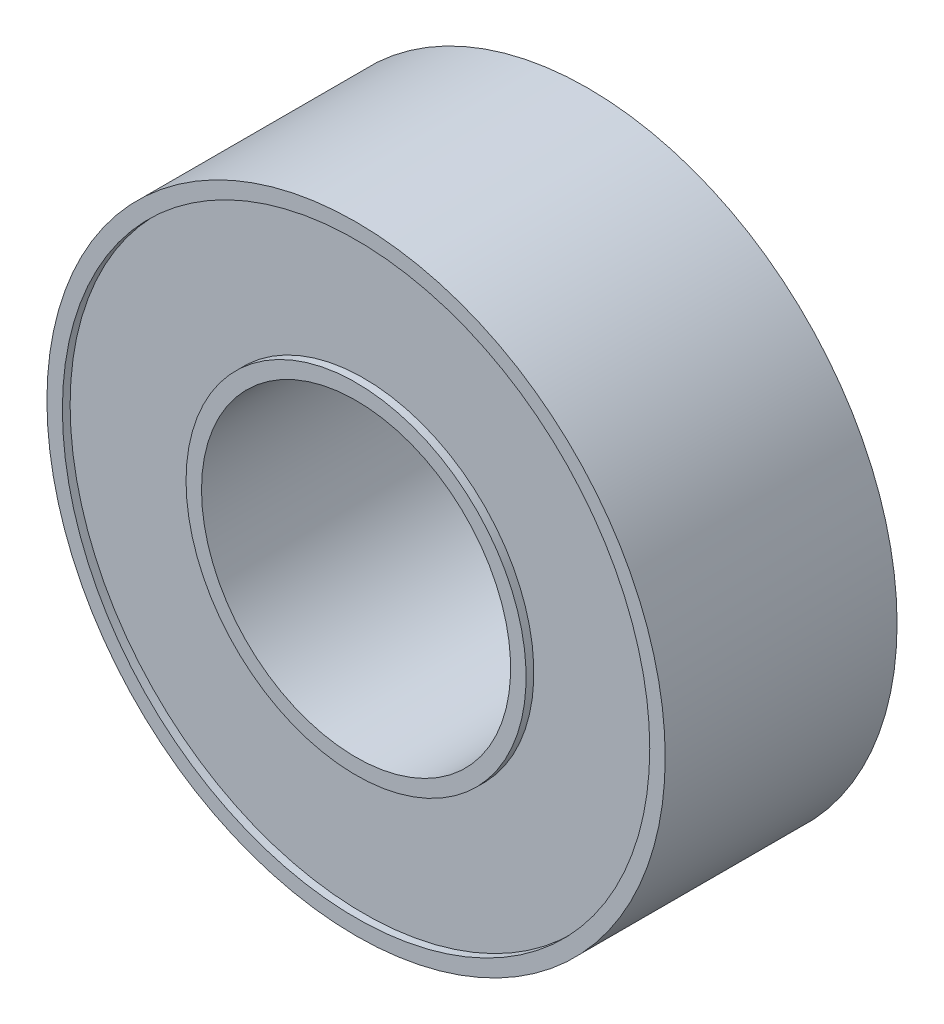
ISO-10303-21;
HEADER;
FILE_DESCRIPTION(('STEP AP214'),'2;1');
FILE_NAME('part.step','',(''),(''),'','','');
FILE_SCHEMA(('AUTOMOTIVE_DESIGN { 1 0 10303 214 1 1 1 1 }'));
ENDSEC;
DATA;
#1=APPLICATION_CONTEXT('core data for automotive mechanical design processes');
#2=APPLICATION_PROTOCOL_DEFINITION('international standard','automotive_design',2000,#1);
#3=PRODUCT_CONTEXT('',#1,'mechanical');
#4=PRODUCT('Part','Part','',(#3));
#5=PRODUCT_RELATED_PRODUCT_CATEGORY('part','',(#4));
#6=PRODUCT_DEFINITION_FORMATION('','',#4);
#7=PRODUCT_DEFINITION_CONTEXT('part definition',#1,'design');
#8=PRODUCT_DEFINITION('design','',#6,#7);
#9=PRODUCT_DEFINITION_SHAPE('','',#8);
#10=(LENGTH_UNIT() NAMED_UNIT(*) SI_UNIT(.MILLI.,.METRE.));
#11=(NAMED_UNIT(*) PLANE_ANGLE_UNIT() SI_UNIT($,.RADIAN.));
#12=(NAMED_UNIT(*) SI_UNIT($,.STERADIAN.) SOLID_ANGLE_UNIT());
#13=UNCERTAINTY_MEASURE_WITH_UNIT(LENGTH_MEASURE(1.E-05),#10,'distance_accuracy_value','');
#14=(GEOMETRIC_REPRESENTATION_CONTEXT(3) GLOBAL_UNCERTAINTY_ASSIGNED_CONTEXT((#13)) GLOBAL_UNIT_ASSIGNED_CONTEXT((#10,
#11,#12)) REPRESENTATION_CONTEXT('',''));
#15=CARTESIAN_POINT('',(0.,0.,0.));
#16=DIRECTION('',(0.,0.,1.));
#17=DIRECTION('',(1.,0.,0.));
#18=AXIS2_PLACEMENT_3D('',#15,#16,#17);
#19=CARTESIAN_POINT('',(0.,0.,-1.5));
#20=DIRECTION('',(0.,0.,1.));
#21=DIRECTION('',(1.,0.,0.));
#22=AXIS2_PLACEMENT_3D('',#19,#20,#21);
#23=PLANE('',#22);
#24=CARTESIAN_POINT('',(0.,0.,-1.5));
#25=DIRECTION('',(0.,0.,-1.));
#26=DIRECTION('',(1.,0.,0.));
#27=AXIS2_PLACEMENT_3D('',#24,#25,#26);
#28=CIRCLE('',#27,3.8);
#29=CARTESIAN_POINT('',(-3.8,0.,-1.5));
#30=VERTEX_POINT('',#29);
#31=EDGE_CURVE('P0_E61',#30,#30,#28,.T.);
#32=ORIENTED_EDGE('',*,*,#31,.F.);
#33=EDGE_LOOP('',(#32));
#34=FACE_BOUND('',#33,.T.);
#35=CARTESIAN_POINT('',(0.,0.,-1.5));
#36=DIRECTION('',(0.,0.,1.));
#37=DIRECTION('',(1.,0.,0.));
#38=AXIS2_PLACEMENT_3D('',#35,#36,#37);
#39=CIRCLE('',#38,4.);
#40=CARTESIAN_POINT('',(-4.,0.,-1.5));
#41=VERTEX_POINT('',#40);
#42=EDGE_CURVE('P0_E26',#41,#41,#39,.T.);
#43=ORIENTED_EDGE('',*,*,#42,.F.);
#44=EDGE_LOOP('',(#43));
#45=FACE_BOUND('',#44,.T.);
#46=ADVANCED_FACE('P0_F17',(#34,#45),#23,.F.);
#47=CARTESIAN_POINT('',(0.,0.,0.));
#48=DIRECTION('',(0.,0.,1.));
#49=DIRECTION('',(1.,0.,0.));
#50=AXIS2_PLACEMENT_3D('',#47,#48,#49);
#51=CYLINDRICAL_SURFACE('',#50,4.);
#52=ORIENTED_EDGE('',*,*,#42,.T.);
#53=DIRECTION('',(0.,0.,1.));
#54=VECTOR('',#53,1.);
#55=CARTESIAN_POINT('',(-4.,0.,0.));
#56=LINE('',#55,#54);
#57=CARTESIAN_POINT('',(-4.,0.,1.5));
#58=VERTEX_POINT('',#57);
#59=EDGE_CURVE('P0_E11',#41,#58,#56,.T.);
#60=ORIENTED_EDGE('',*,*,#59,.T.);
#61=CARTESIAN_POINT('',(0.,0.,1.5));
#62=DIRECTION('',(0.,0.,-1.));
#63=DIRECTION('',(1.,0.,0.));
#64=AXIS2_PLACEMENT_3D('',#61,#62,#63);
#65=CIRCLE('',#64,4.);
#66=EDGE_CURVE('P0_E52',#58,#58,#65,.T.);
#67=ORIENTED_EDGE('',*,*,#66,.T.);
#68=ORIENTED_EDGE('',*,*,#59,.F.);
#69=EDGE_LOOP('',(#52,#60,#67,#68));
#70=FACE_BOUND('',#69,.T.);
#71=ADVANCED_FACE('P0_F50',(#70),#51,.T.);
#72=CARTESIAN_POINT('',(0.,0.,0.));
#73=DIRECTION('',(0.,0.,1.));
#74=DIRECTION('',(1.,0.,0.));
#75=AXIS2_PLACEMENT_3D('',#72,#73,#74);
#76=CYLINDRICAL_SURFACE('',#75,3.8);
#77=ORIENTED_EDGE('',*,*,#31,.T.);
#78=DIRECTION('',(0.,0.,1.));
#79=VECTOR('',#78,1.);
#80=CARTESIAN_POINT('',(-3.8,0.,0.));
#81=LINE('',#80,#79);
#82=CARTESIAN_POINT('',(-3.8,0.,1.5));
#83=VERTEX_POINT('',#82);
#84=EDGE_CURVE('P0_E47',#30,#83,#81,.T.);
#85=ORIENTED_EDGE('',*,*,#84,.T.);
#86=CARTESIAN_POINT('',(0.,0.,1.5));
#87=DIRECTION('',(0.,0.,1.));
#88=DIRECTION('',(1.,0.,0.));
#89=AXIS2_PLACEMENT_3D('',#86,#87,#88);
#90=CIRCLE('',#89,3.8);
#91=EDGE_CURVE('P0_E64',#83,#83,#90,.T.);
#92=ORIENTED_EDGE('',*,*,#91,.T.);
#93=ORIENTED_EDGE('',*,*,#84,.F.);
#94=EDGE_LOOP('',(#77,#85,#92,#93));
#95=FACE_BOUND('',#94,.T.);
#96=ADVANCED_FACE('P0_F96',(#95),#76,.F.);
#97=CARTESIAN_POINT('',(0.,0.,1.5));
#98=DIRECTION('',(0.,0.,1.));
#99=DIRECTION('',(1.,0.,0.));
#100=AXIS2_PLACEMENT_3D('',#97,#98,#99);
#101=PLANE('',#100);
#102=ORIENTED_EDGE('',*,*,#91,.F.);
#103=EDGE_LOOP('',(#102));
#104=FACE_BOUND('',#103,.T.);
#105=ORIENTED_EDGE('',*,*,#66,.F.);
#106=EDGE_LOOP('',(#105));
#107=FACE_BOUND('',#106,.T.);
#108=ADVANCED_FACE('P0_F92',(#104,#107),#101,.T.);
#109=CLOSED_SHELL('',(#46,#71,#96,#108));
#110=MANIFOLD_SOLID_BREP('P0_B1',#109);
#111=CARTESIAN_POINT('',(0.,0.,-1.5));
#112=DIRECTION('',(0.,0.,1.));
#113=DIRECTION('',(1.,0.,0.));
#114=AXIS2_PLACEMENT_3D('',#111,#112,#113);
#115=PLANE('',#114);
#116=CARTESIAN_POINT('',(0.,0.,-1.5));
#117=DIRECTION('',(0.,0.,-1.));
#118=DIRECTION('',(1.,0.,0.));
#119=AXIS2_PLACEMENT_3D('',#116,#117,#118);
#120=CIRCLE('',#119,2.);
#121=CARTESIAN_POINT('',(-2.,0.,-1.5));
#122=VERTEX_POINT('',#121);
#123=EDGE_CURVE('P1_E61',#122,#122,#120,.T.);
#124=ORIENTED_EDGE('',*,*,#123,.F.);
#125=EDGE_LOOP('',(#124));
#126=FACE_BOUND('',#125,.T.);
#127=CARTESIAN_POINT('',(0.,0.,-1.5));
#128=DIRECTION('',(0.,0.,1.));
#129=DIRECTION('',(1.,0.,0.));
#130=AXIS2_PLACEMENT_3D('',#127,#128,#129);
#131=CIRCLE('',#130,2.2);
#132=CARTESIAN_POINT('',(-2.2,0.,-1.5));
#133=VERTEX_POINT('',#132);
#134=EDGE_CURVE('P1_E25',#133,#133,#131,.T.);
#135=ORIENTED_EDGE('',*,*,#134,.F.);
#136=EDGE_LOOP('',(#135));
#137=FACE_BOUND('',#136,.T.);
#138=ADVANCED_FACE('P1_F17',(#126,#137),#115,.F.);
#139=CARTESIAN_POINT('',(0.,0.,0.));
#140=DIRECTION('',(0.,0.,1.));
#141=DIRECTION('',(1.,0.,0.));
#142=AXIS2_PLACEMENT_3D('',#139,#140,#141);
#143=CYLINDRICAL_SURFACE('',#142,2.2);
#144=ORIENTED_EDGE('',*,*,#134,.T.);
#145=DIRECTION('',(0.,0.,1.));
#146=VECTOR('',#145,1.);
#147=CARTESIAN_POINT('',(-2.2,0.,0.));
#148=LINE('',#147,#146);
#149=CARTESIAN_POINT('',(-2.2,0.,1.5));
#150=VERTEX_POINT('',#149);
#151=EDGE_CURVE('P1_E11',#133,#150,#148,.T.);
#152=ORIENTED_EDGE('',*,*,#151,.T.);
#153=CARTESIAN_POINT('',(0.,0.,1.5));
#154=DIRECTION('',(0.,0.,-1.));
#155=DIRECTION('',(1.,0.,0.));
#156=AXIS2_PLACEMENT_3D('',#153,#154,#155);
#157=CIRCLE('',#156,2.2);
#158=EDGE_CURVE('P1_E53',#150,#150,#157,.T.);
#159=ORIENTED_EDGE('',*,*,#158,.T.);
#160=ORIENTED_EDGE('',*,*,#151,.F.);
#161=EDGE_LOOP('',(#144,#152,#159,#160));
#162=FACE_BOUND('',#161,.T.);
#163=ADVANCED_FACE('P1_F51',(#162),#143,.T.);
#164=CARTESIAN_POINT('',(0.,0.,0.));
#165=DIRECTION('',(0.,0.,1.));
#166=DIRECTION('',(1.,0.,0.));
#167=AXIS2_PLACEMENT_3D('',#164,#165,#166);
#168=CYLINDRICAL_SURFACE('',#167,2.);
#169=ORIENTED_EDGE('',*,*,#123,.T.);
#170=DIRECTION('',(0.,0.,1.));
#171=VECTOR('',#170,1.);
#172=CARTESIAN_POINT('',(-2.,0.,0.));
#173=LINE('',#172,#171);
#174=CARTESIAN_POINT('',(-2.,0.,1.5));
#175=VERTEX_POINT('',#174);
#176=EDGE_CURVE('P1_E44',#122,#175,#173,.T.);
#177=ORIENTED_EDGE('',*,*,#176,.T.);
#178=CARTESIAN_POINT('',(0.,0.,1.5));
#179=DIRECTION('',(0.,0.,1.));
#180=DIRECTION('',(1.,0.,0.));
#181=AXIS2_PLACEMENT_3D('',#178,#179,#180);
#182=CIRCLE('',#181,2.);
#183=EDGE_CURVE('P1_E66',#175,#175,#182,.T.);
#184=ORIENTED_EDGE('',*,*,#183,.T.);
#185=ORIENTED_EDGE('',*,*,#176,.F.);
#186=EDGE_LOOP('',(#169,#177,#184,#185));
#187=FACE_BOUND('',#186,.T.);
#188=ADVANCED_FACE('P1_F95',(#187),#168,.F.);
#189=CARTESIAN_POINT('',(0.,0.,1.5));
#190=DIRECTION('',(0.,0.,1.));
#191=DIRECTION('',(1.,0.,0.));
#192=AXIS2_PLACEMENT_3D('',#189,#190,#191);
#193=PLANE('',#192);
#194=ORIENTED_EDGE('',*,*,#183,.F.);
#195=EDGE_LOOP('',(#194));
#196=FACE_BOUND('',#195,.T.);
#197=ORIENTED_EDGE('',*,*,#158,.F.);
#198=EDGE_LOOP('',(#197));
#199=FACE_BOUND('',#198,.T.);
#200=ADVANCED_FACE('P1_F91',(#196,#199),#193,.T.);
#201=CLOSED_SHELL('',(#138,#163,#188,#200));
#202=MANIFOLD_SOLID_BREP('P1_B1',#201);
#203=CARTESIAN_POINT('',(0.,0.,-1.4));
#204=DIRECTION('',(0.,0.,1.));
#205=DIRECTION('',(1.,0.,0.));
#206=AXIS2_PLACEMENT_3D('',#203,#204,#205);
#207=PLANE('',#206);
#208=CARTESIAN_POINT('',(0.,0.,-1.4));
#209=DIRECTION('',(0.,0.,-1.));
#210=DIRECTION('',(1.,0.,0.));
#211=AXIS2_PLACEMENT_3D('',#208,#209,#210);
#212=CIRCLE('',#211,2.2);
#213=CARTESIAN_POINT('',(-2.2,0.,-1.4));
#214=VERTEX_POINT('',#213);
#215=EDGE_CURVE('P2_E61',#214,#214,#212,.T.);
#216=ORIENTED_EDGE('',*,*,#215,.F.);
#217=EDGE_LOOP('',(#216));
#218=FACE_BOUND('',#217,.T.);
#219=CARTESIAN_POINT('',(0.,0.,-1.4));
#220=DIRECTION('',(0.,0.,1.));
#221=DIRECTION('',(1.,0.,0.));
#222=AXIS2_PLACEMENT_3D('',#219,#220,#221);
#223=CIRCLE('',#222,3.8);
#224=CARTESIAN_POINT('',(-3.8,0.,-1.4));
#225=VERTEX_POINT('',#224);
#226=EDGE_CURVE('P2_E20',#225,#225,#223,.T.);
#227=ORIENTED_EDGE('',*,*,#226,.F.);
#228=EDGE_LOOP('',(#227));
#229=FACE_BOUND('',#228,.T.);
#230=ADVANCED_FACE('P2_F17',(#218,#229),#207,.F.);
#231=CARTESIAN_POINT('',(0.,0.,0.));
#232=DIRECTION('',(0.,0.,1.));
#233=DIRECTION('',(1.,0.,0.));
#234=AXIS2_PLACEMENT_3D('',#231,#232,#233);
#235=CYLINDRICAL_SURFACE('',#234,3.8);
#236=ORIENTED_EDGE('',*,*,#226,.T.);
#237=DIRECTION('',(0.,0.,1.));
#238=VECTOR('',#237,1.);
#239=CARTESIAN_POINT('',(-3.8,0.,0.));
#240=LINE('',#239,#238);
#241=CARTESIAN_POINT('',(-3.8,0.,1.4));
#242=VERTEX_POINT('',#241);
#243=EDGE_CURVE('P2_E11',#225,#242,#240,.T.);
#244=ORIENTED_EDGE('',*,*,#243,.T.);
#245=CARTESIAN_POINT('',(0.,0.,1.4));
#246=DIRECTION('',(0.,0.,-1.));
#247=DIRECTION('',(1.,0.,0.));
#248=AXIS2_PLACEMENT_3D('',#245,#246,#247);
#249=CIRCLE('',#248,3.8);
#250=EDGE_CURVE('P2_E53',#242,#242,#249,.T.);
#251=ORIENTED_EDGE('',*,*,#250,.T.);
#252=ORIENTED_EDGE('',*,*,#243,.F.);
#253=EDGE_LOOP('',(#236,#244,#251,#252));
#254=FACE_BOUND('',#253,.T.);
#255=ADVANCED_FACE('P2_F51',(#254),#235,.T.);
#256=CARTESIAN_POINT('',(0.,0.,0.));
#257=DIRECTION('',(0.,0.,1.));
#258=DIRECTION('',(1.,0.,0.));
#259=AXIS2_PLACEMENT_3D('',#256,#257,#258);
#260=CYLINDRICAL_SURFACE('',#259,2.2);
#261=ORIENTED_EDGE('',*,*,#215,.T.);
#262=DIRECTION('',(0.,0.,1.));
#263=VECTOR('',#262,1.);
#264=CARTESIAN_POINT('',(-2.2,0.,0.));
#265=LINE('',#264,#263);
#266=CARTESIAN_POINT('',(-2.2,0.,1.4));
#267=VERTEX_POINT('',#266);
#268=EDGE_CURVE('P2_E47',#214,#267,#265,.T.);
#269=ORIENTED_EDGE('',*,*,#268,.T.);
#270=CARTESIAN_POINT('',(0.,0.,1.4));
#271=DIRECTION('',(0.,0.,1.));
#272=DIRECTION('',(1.,0.,0.));
#273=AXIS2_PLACEMENT_3D('',#270,#271,#272);
#274=CIRCLE('',#273,2.2);
#275=EDGE_CURVE('P2_E66',#267,#267,#274,.T.);
#276=ORIENTED_EDGE('',*,*,#275,.T.);
#277=ORIENTED_EDGE('',*,*,#268,.F.);
#278=EDGE_LOOP('',(#261,#269,#276,#277));
#279=FACE_BOUND('',#278,.T.);
#280=ADVANCED_FACE('P2_F91',(#279),#260,.F.);
#281=CARTESIAN_POINT('',(0.,0.,1.4));
#282=DIRECTION('',(0.,0.,1.));
#283=DIRECTION('',(1.,0.,0.));
#284=AXIS2_PLACEMENT_3D('',#281,#282,#283);
#285=PLANE('',#284);
#286=ORIENTED_EDGE('',*,*,#275,.F.);
#287=EDGE_LOOP('',(#286));
#288=FACE_BOUND('',#287,.T.);
#289=ORIENTED_EDGE('',*,*,#250,.F.);
#290=EDGE_LOOP('',(#289));
#291=FACE_BOUND('',#290,.T.);
#292=ADVANCED_FACE('P2_F96',(#288,#291),#285,.T.);
#293=CLOSED_SHELL('',(#230,#255,#280,#292));
#294=MANIFOLD_SOLID_BREP('P2_B1',#293);
#295=ADVANCED_BREP_SHAPE_REPRESENTATION('',(#18,#110,#202,#294),#14);
#296=SHAPE_DEFINITION_REPRESENTATION(#9,#295);
ENDSEC;
END-ISO-10303-21;
